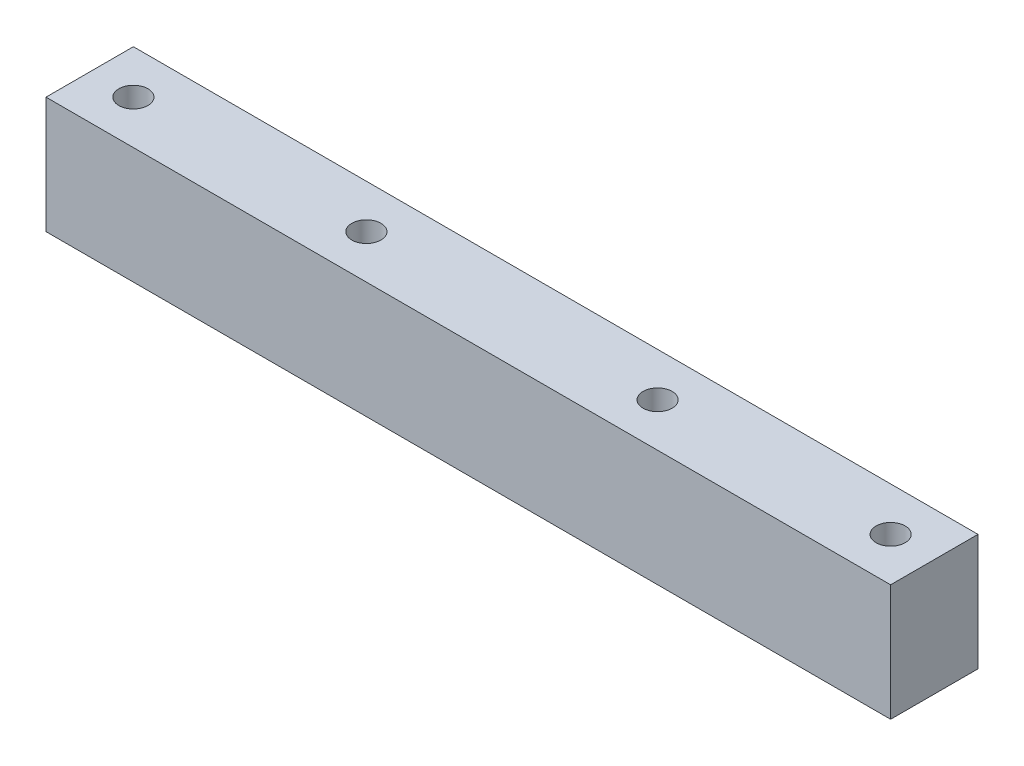
ISO-10303-21;
HEADER;
FILE_DESCRIPTION(('STEP AP214'),'2;1');
FILE_NAME('part.step','',(''),(''),'','','');
FILE_SCHEMA(('AUTOMOTIVE_DESIGN { 1 0 10303 214 1 1 1 1 }'));
ENDSEC;
DATA;
#1=APPLICATION_CONTEXT('core data for automotive mechanical design processes');
#2=APPLICATION_PROTOCOL_DEFINITION('international standard','automotive_design',2000,#1);
#3=PRODUCT_CONTEXT('',#1,'mechanical');
#4=PRODUCT('Part','Part','',(#3));
#5=PRODUCT_RELATED_PRODUCT_CATEGORY('part','',(#4));
#6=PRODUCT_DEFINITION_FORMATION('','',#4);
#7=PRODUCT_DEFINITION_CONTEXT('part definition',#1,'design');
#8=PRODUCT_DEFINITION('design','',#6,#7);
#9=PRODUCT_DEFINITION_SHAPE('','',#8);
#10=(LENGTH_UNIT() NAMED_UNIT(*) SI_UNIT(.MILLI.,.METRE.));
#11=(NAMED_UNIT(*) PLANE_ANGLE_UNIT() SI_UNIT($,.RADIAN.));
#12=(NAMED_UNIT(*) SI_UNIT($,.STERADIAN.) SOLID_ANGLE_UNIT());
#13=UNCERTAINTY_MEASURE_WITH_UNIT(LENGTH_MEASURE(1.E-05),#10,'distance_accuracy_value','');
#14=(GEOMETRIC_REPRESENTATION_CONTEXT(3) GLOBAL_UNCERTAINTY_ASSIGNED_CONTEXT((#13)) GLOBAL_UNIT_ASSIGNED_CONTEXT((#10,
#11,#12)) REPRESENTATION_CONTEXT('',''));
#15=CARTESIAN_POINT('',(0.,0.,0.));
#16=DIRECTION('',(0.,0.,1.));
#17=DIRECTION('',(1.,0.,0.));
#18=AXIS2_PLACEMENT_3D('',#15,#16,#17);
#19=CARTESIAN_POINT('',(0.,0.,15.));
#20=DIRECTION('',(1.,0.,0.));
#21=DIRECTION('',(0.,0.,-1.));
#22=AXIS2_PLACEMENT_3D('',#19,#20,#21);
#23=PLANE('',#22);
#24=DIRECTION('',(0.,-1.,0.));
#25=VECTOR('',#24,1.);
#26=CARTESIAN_POINT('',(0.,0.,0.));
#27=LINE('',#26,#25);
#28=CARTESIAN_POINT('',(0.,20.,0.));
#29=VERTEX_POINT('',#28);
#30=CARTESIAN_POINT('',(0.,0.,0.));
#31=VERTEX_POINT('',#30);
#32=EDGE_CURVE('E146',#29,#31,#27,.T.);
#33=ORIENTED_EDGE('',*,*,#32,.T.);
#34=DIRECTION('',(0.,0.,-1.));
#35=VECTOR('',#34,1.);
#36=CARTESIAN_POINT('',(0.,0.,15.));
#37=LINE('',#36,#35);
#38=CARTESIAN_POINT('',(0.,0.,15.));
#39=VERTEX_POINT('',#38);
#40=EDGE_CURVE('E11',#39,#31,#37,.T.);
#41=ORIENTED_EDGE('',*,*,#40,.F.);
#42=DIRECTION('',(0.,-1.,0.));
#43=VECTOR('',#42,1.);
#44=CARTESIAN_POINT('',(0.,0.,15.));
#45=LINE('',#44,#43);
#46=CARTESIAN_POINT('',(0.,20.,15.));
#47=VERTEX_POINT('',#46);
#48=EDGE_CURVE('E147',#47,#39,#45,.T.);
#49=ORIENTED_EDGE('',*,*,#48,.F.);
#50=DIRECTION('',(0.,0.,-1.));
#51=VECTOR('',#50,1.);
#52=CARTESIAN_POINT('',(0.,20.,15.));
#53=LINE('',#52,#51);
#54=EDGE_CURVE('E153',#47,#29,#53,.T.);
#55=ORIENTED_EDGE('',*,*,#54,.T.);
#56=EDGE_LOOP('',(#33,#41,#49,#55));
#57=FACE_BOUND('',#56,.T.);
#58=ADVANCED_FACE('F17',(#57),#23,.F.);
#59=CARTESIAN_POINT('',(0.,0.,15.));
#60=DIRECTION('',(0.,1.,0.));
#61=DIRECTION('',(0.,0.,1.));
#62=AXIS2_PLACEMENT_3D('',#59,#60,#61);
#63=PLANE('',#62);
#64=CARTESIAN_POINT('',(15.,0.,7.5));
#65=DIRECTION('',(0.,-1.,0.));
#66=DIRECTION('',(0.,0.,-1.));
#67=AXIS2_PLACEMENT_3D('',#64,#65,#66);
#68=CIRCLE('',#67,2.5);
#69=CARTESIAN_POINT('',(15.,0.,5.));
#70=VERTEX_POINT('',#69);
#71=EDGE_CURVE('E122',#70,#70,#68,.T.);
#72=ORIENTED_EDGE('',*,*,#71,.F.);
#73=EDGE_LOOP('',(#72));
#74=FACE_BOUND('',#73,.T.);
#75=CARTESIAN_POINT('',(55.,0.,7.5));
#76=DIRECTION('',(0.,-1.,0.));
#77=DIRECTION('',(0.,0.,-1.));
#78=AXIS2_PLACEMENT_3D('',#75,#76,#77);
#79=CIRCLE('',#78,2.5);
#80=CARTESIAN_POINT('',(55.,0.,5.));
#81=VERTEX_POINT('',#80);
#82=EDGE_CURVE('E128',#81,#81,#79,.T.);
#83=ORIENTED_EDGE('',*,*,#82,.F.);
#84=EDGE_LOOP('',(#83));
#85=FACE_BOUND('',#84,.T.);
#86=CARTESIAN_POINT('',(90.,0.,7.5));
#87=DIRECTION('',(0.,-1.,0.));
#88=DIRECTION('',(0.,0.,-1.));
#89=AXIS2_PLACEMENT_3D('',#86,#87,#88);
#90=CIRCLE('',#89,2.5);
#91=CARTESIAN_POINT('',(90.,0.,5.));
#92=VERTEX_POINT('',#91);
#93=EDGE_CURVE('E134',#92,#92,#90,.T.);
#94=ORIENTED_EDGE('',*,*,#93,.F.);
#95=EDGE_LOOP('',(#94));
#96=FACE_BOUND('',#95,.T.);
#97=CARTESIAN_POINT('',(130.,0.,7.5));
#98=DIRECTION('',(0.,-1.,0.));
#99=DIRECTION('',(0.,0.,-1.));
#100=AXIS2_PLACEMENT_3D('',#97,#98,#99);
#101=CIRCLE('',#100,2.5);
#102=CARTESIAN_POINT('',(130.,0.,5.));
#103=VERTEX_POINT('',#102);
#104=EDGE_CURVE('E140',#103,#103,#101,.T.);
#105=ORIENTED_EDGE('',*,*,#104,.F.);
#106=EDGE_LOOP('',(#105));
#107=FACE_BOUND('',#106,.T.);
#108=DIRECTION('',(1.,0.,0.));
#109=VECTOR('',#108,1.);
#110=CARTESIAN_POINT('',(0.,0.,0.));
#111=LINE('',#110,#109);
#112=CARTESIAN_POINT('',(145.,0.,0.));
#113=VERTEX_POINT('',#112);
#114=EDGE_CURVE('E156',#31,#113,#111,.T.);
#115=ORIENTED_EDGE('',*,*,#114,.T.);
#116=DIRECTION('',(0.,0.,-1.));
#117=VECTOR('',#116,1.);
#118=CARTESIAN_POINT('',(145.,0.,15.));
#119=LINE('',#118,#117);
#120=CARTESIAN_POINT('',(145.,0.,15.));
#121=VERTEX_POINT('',#120);
#122=EDGE_CURVE('E25',#121,#113,#119,.T.);
#123=ORIENTED_EDGE('',*,*,#122,.F.);
#124=DIRECTION('',(1.,0.,0.));
#125=VECTOR('',#124,1.);
#126=CARTESIAN_POINT('',(0.,0.,15.));
#127=LINE('',#126,#125);
#128=EDGE_CURVE('E64',#39,#121,#127,.T.);
#129=ORIENTED_EDGE('',*,*,#128,.F.);
#130=ORIENTED_EDGE('',*,*,#40,.T.);
#131=EDGE_LOOP('',(#115,#123,#129,#130));
#132=FACE_BOUND('',#131,.T.);
#133=ADVANCED_FACE('F181',(#74,#85,#96,#107,#132),#63,.F.);
#134=CARTESIAN_POINT('',(145.,0.,15.));
#135=DIRECTION('',(-1.,0.,0.));
#136=DIRECTION('',(0.,0.,1.));
#137=AXIS2_PLACEMENT_3D('',#134,#135,#136);
#138=PLANE('',#137);
#139=DIRECTION('',(0.,1.,0.));
#140=VECTOR('',#139,1.);
#141=CARTESIAN_POINT('',(145.,0.,0.));
#142=LINE('',#141,#140);
#143=CARTESIAN_POINT('',(145.,20.,0.));
#144=VERTEX_POINT('',#143);
#145=EDGE_CURVE('E51',#113,#144,#142,.T.);
#146=ORIENTED_EDGE('',*,*,#145,.T.);
#147=DIRECTION('',(0.,0.,-1.));
#148=VECTOR('',#147,1.);
#149=CARTESIAN_POINT('',(145.,20.,15.));
#150=LINE('',#149,#148);
#151=CARTESIAN_POINT('',(145.,20.,15.));
#152=VERTEX_POINT('',#151);
#153=EDGE_CURVE('E161',#152,#144,#150,.T.);
#154=ORIENTED_EDGE('',*,*,#153,.F.);
#155=DIRECTION('',(0.,1.,0.));
#156=VECTOR('',#155,1.);
#157=CARTESIAN_POINT('',(145.,0.,15.));
#158=LINE('',#157,#156);
#159=EDGE_CURVE('E150',#121,#152,#158,.T.);
#160=ORIENTED_EDGE('',*,*,#159,.F.);
#161=ORIENTED_EDGE('',*,*,#122,.T.);
#162=EDGE_LOOP('',(#146,#154,#160,#161));
#163=FACE_BOUND('',#162,.T.);
#164=ADVANCED_FACE('F163',(#163),#138,.F.);
#165=CARTESIAN_POINT('',(0.,20.,15.));
#166=DIRECTION('',(0.,-1.,0.));
#167=DIRECTION('',(0.,0.,-1.));
#168=AXIS2_PLACEMENT_3D('',#165,#166,#167);
#169=PLANE('',#168);
#170=CARTESIAN_POINT('',(137.5,20.,7.5));
#171=DIRECTION('',(0.,1.,0.));
#172=DIRECTION('',(0.,0.,1.));
#173=AXIS2_PLACEMENT_3D('',#170,#171,#172);
#174=CIRCLE('',#173,2.5);
#175=CARTESIAN_POINT('',(137.5,20.,10.));
#176=VERTEX_POINT('',#175);
#177=EDGE_CURVE('E100',#176,#176,#174,.T.);
#178=ORIENTED_EDGE('',*,*,#177,.F.);
#179=EDGE_LOOP('',(#178));
#180=FACE_BOUND('',#179,.T.);
#181=CARTESIAN_POINT('',(97.5,20.,7.5));
#182=DIRECTION('',(0.,1.,0.));
#183=DIRECTION('',(0.,0.,1.));
#184=AXIS2_PLACEMENT_3D('',#181,#182,#183);
#185=CIRCLE('',#184,2.5);
#186=CARTESIAN_POINT('',(97.5,20.,10.));
#187=VERTEX_POINT('',#186);
#188=EDGE_CURVE('E99',#187,#187,#185,.T.);
#189=ORIENTED_EDGE('',*,*,#188,.F.);
#190=EDGE_LOOP('',(#189));
#191=FACE_BOUND('',#190,.T.);
#192=CARTESIAN_POINT('',(47.5,20.,7.5));
#193=DIRECTION('',(0.,1.,0.));
#194=DIRECTION('',(0.,0.,1.));
#195=AXIS2_PLACEMENT_3D('',#192,#193,#194);
#196=CIRCLE('',#195,2.5);
#197=CARTESIAN_POINT('',(47.5,20.,10.));
#198=VERTEX_POINT('',#197);
#199=EDGE_CURVE('E110',#198,#198,#196,.T.);
#200=ORIENTED_EDGE('',*,*,#199,.F.);
#201=EDGE_LOOP('',(#200));
#202=FACE_BOUND('',#201,.T.);
#203=CARTESIAN_POINT('',(7.5,20.,7.5));
#204=DIRECTION('',(0.,1.,0.));
#205=DIRECTION('',(0.,0.,1.));
#206=AXIS2_PLACEMENT_3D('',#203,#204,#205);
#207=CIRCLE('',#206,2.5);
#208=CARTESIAN_POINT('',(7.5,20.,10.));
#209=VERTEX_POINT('',#208);
#210=EDGE_CURVE('E116',#209,#209,#207,.T.);
#211=ORIENTED_EDGE('',*,*,#210,.F.);
#212=EDGE_LOOP('',(#211));
#213=FACE_BOUND('',#212,.T.);
#214=DIRECTION('',(-1.,0.,0.));
#215=VECTOR('',#214,1.);
#216=CARTESIAN_POINT('',(0.,20.,0.));
#217=LINE('',#216,#215);
#218=EDGE_CURVE('E57',#144,#29,#217,.T.);
#219=ORIENTED_EDGE('',*,*,#218,.T.);
#220=ORIENTED_EDGE('',*,*,#54,.F.);
#221=DIRECTION('',(-1.,0.,0.));
#222=VECTOR('',#221,1.);
#223=CARTESIAN_POINT('',(0.,20.,15.));
#224=LINE('',#223,#222);
#225=EDGE_CURVE('E33',#152,#47,#224,.T.);
#226=ORIENTED_EDGE('',*,*,#225,.F.);
#227=ORIENTED_EDGE('',*,*,#153,.T.);
#228=EDGE_LOOP('',(#219,#220,#226,#227));
#229=FACE_BOUND('',#228,.T.);
#230=ADVANCED_FACE('F170',(#180,#191,#202,#213,#229),#169,.F.);
#231=CARTESIAN_POINT('',(0.,0.,15.));
#232=DIRECTION('',(0.,0.,-1.));
#233=DIRECTION('',(-1.,0.,0.));
#234=AXIS2_PLACEMENT_3D('',#231,#232,#233);
#235=PLANE('',#234);
#236=ORIENTED_EDGE('',*,*,#48,.T.);
#237=ORIENTED_EDGE('',*,*,#128,.T.);
#238=ORIENTED_EDGE('',*,*,#159,.T.);
#239=ORIENTED_EDGE('',*,*,#225,.T.);
#240=EDGE_LOOP('',(#236,#237,#238,#239));
#241=FACE_BOUND('',#240,.T.);
#242=ADVANCED_FACE('F172',(#241),#235,.F.);
#243=CARTESIAN_POINT('',(0.,0.,0.));
#244=DIRECTION('',(0.,0.,-1.));
#245=DIRECTION('',(-1.,0.,0.));
#246=AXIS2_PLACEMENT_3D('',#243,#244,#245);
#247=PLANE('',#246);
#248=ORIENTED_EDGE('',*,*,#32,.F.);
#249=ORIENTED_EDGE('',*,*,#218,.F.);
#250=ORIENTED_EDGE('',*,*,#145,.F.);
#251=ORIENTED_EDGE('',*,*,#114,.F.);
#252=EDGE_LOOP('',(#248,#249,#250,#251));
#253=FACE_BOUND('',#252,.T.);
#254=ADVANCED_FACE('F166',(#253),#247,.T.);
#255=CARTESIAN_POINT('',(130.,15.,7.5));
#256=DIRECTION('',(0.,-1.,0.));
#257=DIRECTION('',(0.,0.,-1.));
#258=AXIS2_PLACEMENT_3D('',#255,#256,#257);
#259=CONICAL_SURFACE('',#258,2.5,1.02974425867665);
#260=CARTESIAN_POINT('',(130.,16.5021515475689,7.5));
#261=VERTEX_POINT('',#260);
#262=VERTEX_LOOP('',#261);
#263=FACE_BOUND('',#262,.T.);
#264=CARTESIAN_POINT('',(130.,15.,7.5));
#265=DIRECTION('',(0.,-1.,0.));
#266=DIRECTION('',(0.,0.,-1.));
#267=AXIS2_PLACEMENT_3D('',#264,#265,#266);
#268=CIRCLE('',#267,2.5);
#269=CARTESIAN_POINT('',(130.,15.,5.));
#270=VERTEX_POINT('',#269);
#271=EDGE_CURVE('E143',#270,#270,#268,.T.);
#272=ORIENTED_EDGE('',*,*,#271,.T.);
#273=EDGE_LOOP('',(#272));
#274=FACE_BOUND('',#273,.T.);
#275=ADVANCED_FACE('F204',(#263,#274),#259,.F.);
#276=CARTESIAN_POINT('',(130.,0.,7.5));
#277=DIRECTION('',(0.,-1.,0.));
#278=DIRECTION('',(0.,0.,-1.));
#279=AXIS2_PLACEMENT_3D('',#276,#277,#278);
#280=CYLINDRICAL_SURFACE('',#279,2.5);
#281=ORIENTED_EDGE('',*,*,#271,.F.);
#282=EDGE_LOOP('',(#281));
#283=FACE_BOUND('',#282,.T.);
#284=ORIENTED_EDGE('',*,*,#104,.T.);
#285=EDGE_LOOP('',(#284));
#286=FACE_BOUND('',#285,.T.);
#287=ADVANCED_FACE('F201',(#283,#286),#280,.F.);
#288=CARTESIAN_POINT('',(90.,15.,7.5));
#289=DIRECTION('',(0.,-1.,0.));
#290=DIRECTION('',(0.,0.,-1.));
#291=AXIS2_PLACEMENT_3D('',#288,#289,#290);
#292=CONICAL_SURFACE('',#291,2.5,1.02974425867665);
#293=CARTESIAN_POINT('',(90.,16.5021515475689,7.5));
#294=VERTEX_POINT('',#293);
#295=VERTEX_LOOP('',#294);
#296=FACE_BOUND('',#295,.T.);
#297=CARTESIAN_POINT('',(90.,15.,7.5));
#298=DIRECTION('',(0.,-1.,0.));
#299=DIRECTION('',(0.,0.,-1.));
#300=AXIS2_PLACEMENT_3D('',#297,#298,#299);
#301=CIRCLE('',#300,2.5);
#302=CARTESIAN_POINT('',(90.,15.,5.));
#303=VERTEX_POINT('',#302);
#304=EDGE_CURVE('E137',#303,#303,#301,.T.);
#305=ORIENTED_EDGE('',*,*,#304,.T.);
#306=EDGE_LOOP('',(#305));
#307=FACE_BOUND('',#306,.T.);
#308=ADVANCED_FACE('F203',(#296,#307),#292,.F.);
#309=CARTESIAN_POINT('',(90.,0.,7.5));
#310=DIRECTION('',(0.,-1.,0.));
#311=DIRECTION('',(0.,0.,-1.));
#312=AXIS2_PLACEMENT_3D('',#309,#310,#311);
#313=CYLINDRICAL_SURFACE('',#312,2.5);
#314=ORIENTED_EDGE('',*,*,#304,.F.);
#315=EDGE_LOOP('',(#314));
#316=FACE_BOUND('',#315,.T.);
#317=ORIENTED_EDGE('',*,*,#93,.T.);
#318=EDGE_LOOP('',(#317));
#319=FACE_BOUND('',#318,.T.);
#320=ADVANCED_FACE('F211',(#316,#319),#313,.F.);
#321=CARTESIAN_POINT('',(55.,15.,7.5));
#322=DIRECTION('',(0.,-1.,0.));
#323=DIRECTION('',(0.,0.,-1.));
#324=AXIS2_PLACEMENT_3D('',#321,#322,#323);
#325=CONICAL_SURFACE('',#324,2.5,1.02974425867665);
#326=CARTESIAN_POINT('',(55.,16.5021515475689,7.5));
#327=VERTEX_POINT('',#326);
#328=VERTEX_LOOP('',#327);
#329=FACE_BOUND('',#328,.T.);
#330=CARTESIAN_POINT('',(55.,15.,7.5));
#331=DIRECTION('',(0.,-1.,0.));
#332=DIRECTION('',(0.,0.,-1.));
#333=AXIS2_PLACEMENT_3D('',#330,#331,#332);
#334=CIRCLE('',#333,2.5);
#335=CARTESIAN_POINT('',(55.,15.,5.));
#336=VERTEX_POINT('',#335);
#337=EDGE_CURVE('E131',#336,#336,#334,.T.);
#338=ORIENTED_EDGE('',*,*,#337,.T.);
#339=EDGE_LOOP('',(#338));
#340=FACE_BOUND('',#339,.T.);
#341=ADVANCED_FACE('F254',(#329,#340),#325,.F.);
#342=CARTESIAN_POINT('',(55.,0.,7.5));
#343=DIRECTION('',(0.,-1.,0.));
#344=DIRECTION('',(0.,0.,-1.));
#345=AXIS2_PLACEMENT_3D('',#342,#343,#344);
#346=CYLINDRICAL_SURFACE('',#345,2.5);
#347=ORIENTED_EDGE('',*,*,#337,.F.);
#348=EDGE_LOOP('',(#347));
#349=FACE_BOUND('',#348,.T.);
#350=ORIENTED_EDGE('',*,*,#82,.T.);
#351=EDGE_LOOP('',(#350));
#352=FACE_BOUND('',#351,.T.);
#353=ADVANCED_FACE('F263',(#349,#352),#346,.F.);
#354=CARTESIAN_POINT('',(15.,15.,7.5));
#355=DIRECTION('',(0.,-1.,0.));
#356=DIRECTION('',(0.,0.,-1.));
#357=AXIS2_PLACEMENT_3D('',#354,#355,#356);
#358=CONICAL_SURFACE('',#357,2.5,1.02974425867665);
#359=CARTESIAN_POINT('',(15.,16.5021515475689,7.5));
#360=VERTEX_POINT('',#359);
#361=VERTEX_LOOP('',#360);
#362=FACE_BOUND('',#361,.T.);
#363=CARTESIAN_POINT('',(15.,15.,7.5));
#364=DIRECTION('',(0.,-1.,0.));
#365=DIRECTION('',(0.,0.,-1.));
#366=AXIS2_PLACEMENT_3D('',#363,#364,#365);
#367=CIRCLE('',#366,2.5);
#368=CARTESIAN_POINT('',(15.,15.,5.));
#369=VERTEX_POINT('',#368);
#370=EDGE_CURVE('E125',#369,#369,#367,.T.);
#371=ORIENTED_EDGE('',*,*,#370,.T.);
#372=EDGE_LOOP('',(#371));
#373=FACE_BOUND('',#372,.T.);
#374=ADVANCED_FACE('F273',(#362,#373),#358,.F.);
#375=CARTESIAN_POINT('',(15.,0.,7.5));
#376=DIRECTION('',(0.,-1.,0.));
#377=DIRECTION('',(0.,0.,-1.));
#378=AXIS2_PLACEMENT_3D('',#375,#376,#377);
#379=CYLINDRICAL_SURFACE('',#378,2.5);
#380=ORIENTED_EDGE('',*,*,#370,.F.);
#381=EDGE_LOOP('',(#380));
#382=FACE_BOUND('',#381,.T.);
#383=ORIENTED_EDGE('',*,*,#71,.T.);
#384=EDGE_LOOP('',(#383));
#385=FACE_BOUND('',#384,.T.);
#386=ADVANCED_FACE('F283',(#382,#385),#379,.F.);
#387=CARTESIAN_POINT('',(7.5,5.,7.5));
#388=DIRECTION('',(0.,1.,0.));
#389=DIRECTION('',(0.,0.,1.));
#390=AXIS2_PLACEMENT_3D('',#387,#388,#389);
#391=CONICAL_SURFACE('',#390,2.5,1.02974425867665);
#392=CARTESIAN_POINT('',(7.5,3.4978484524311,7.5));
#393=VERTEX_POINT('',#392);
#394=VERTEX_LOOP('',#393);
#395=FACE_BOUND('',#394,.T.);
#396=CARTESIAN_POINT('',(7.5,5.,7.5));
#397=DIRECTION('',(0.,1.,0.));
#398=DIRECTION('',(0.,0.,1.));
#399=AXIS2_PLACEMENT_3D('',#396,#397,#398);
#400=CIRCLE('',#399,2.5);
#401=CARTESIAN_POINT('',(7.5,5.,10.));
#402=VERTEX_POINT('',#401);
#403=EDGE_CURVE('E119',#402,#402,#400,.T.);
#404=ORIENTED_EDGE('',*,*,#403,.T.);
#405=EDGE_LOOP('',(#404));
#406=FACE_BOUND('',#405,.T.);
#407=ADVANCED_FACE('F293',(#395,#406),#391,.F.);
#408=CARTESIAN_POINT('',(7.5,20.,7.5));
#409=DIRECTION('',(0.,1.,0.));
#410=DIRECTION('',(0.,0.,1.));
#411=AXIS2_PLACEMENT_3D('',#408,#409,#410);
#412=CYLINDRICAL_SURFACE('',#411,2.5);
#413=ORIENTED_EDGE('',*,*,#403,.F.);
#414=EDGE_LOOP('',(#413));
#415=FACE_BOUND('',#414,.T.);
#416=ORIENTED_EDGE('',*,*,#210,.T.);
#417=EDGE_LOOP('',(#416));
#418=FACE_BOUND('',#417,.T.);
#419=ADVANCED_FACE('F303',(#415,#418),#412,.F.);
#420=CARTESIAN_POINT('',(47.5,5.,7.5));
#421=DIRECTION('',(0.,1.,0.));
#422=DIRECTION('',(0.,0.,1.));
#423=AXIS2_PLACEMENT_3D('',#420,#421,#422);
#424=CONICAL_SURFACE('',#423,2.5,1.02974425867665);
#425=CARTESIAN_POINT('',(47.5,3.4978484524311,7.5));
#426=VERTEX_POINT('',#425);
#427=VERTEX_LOOP('',#426);
#428=FACE_BOUND('',#427,.T.);
#429=CARTESIAN_POINT('',(47.5,5.,7.5));
#430=DIRECTION('',(0.,1.,0.));
#431=DIRECTION('',(0.,0.,1.));
#432=AXIS2_PLACEMENT_3D('',#429,#430,#431);
#433=CIRCLE('',#432,2.5);
#434=CARTESIAN_POINT('',(47.5,5.,10.));
#435=VERTEX_POINT('',#434);
#436=EDGE_CURVE('E113',#435,#435,#433,.T.);
#437=ORIENTED_EDGE('',*,*,#436,.T.);
#438=EDGE_LOOP('',(#437));
#439=FACE_BOUND('',#438,.T.);
#440=ADVANCED_FACE('F313',(#428,#439),#424,.F.);
#441=CARTESIAN_POINT('',(47.5,20.,7.5));
#442=DIRECTION('',(0.,1.,0.));
#443=DIRECTION('',(0.,0.,1.));
#444=AXIS2_PLACEMENT_3D('',#441,#442,#443);
#445=CYLINDRICAL_SURFACE('',#444,2.5);
#446=ORIENTED_EDGE('',*,*,#436,.F.);
#447=EDGE_LOOP('',(#446));
#448=FACE_BOUND('',#447,.T.);
#449=ORIENTED_EDGE('',*,*,#199,.T.);
#450=EDGE_LOOP('',(#449));
#451=FACE_BOUND('',#450,.T.);
#452=ADVANCED_FACE('F324',(#448,#451),#445,.F.);
#453=CARTESIAN_POINT('',(97.5,5.,7.5));
#454=DIRECTION('',(0.,1.,0.));
#455=DIRECTION('',(0.,0.,1.));
#456=AXIS2_PLACEMENT_3D('',#453,#454,#455);
#457=CONICAL_SURFACE('',#456,2.5,1.02974425867665);
#458=CARTESIAN_POINT('',(97.5,3.4978484524311,7.5));
#459=VERTEX_POINT('',#458);
#460=VERTEX_LOOP('',#459);
#461=FACE_BOUND('',#460,.T.);
#462=CARTESIAN_POINT('',(97.5,5.,7.5));
#463=DIRECTION('',(0.,1.,0.));
#464=DIRECTION('',(0.,0.,1.));
#465=AXIS2_PLACEMENT_3D('',#462,#463,#464);
#466=CIRCLE('',#465,2.5);
#467=CARTESIAN_POINT('',(97.5,5.,10.));
#468=VERTEX_POINT('',#467);
#469=EDGE_CURVE('E103',#468,#468,#466,.T.);
#470=ORIENTED_EDGE('',*,*,#469,.T.);
#471=EDGE_LOOP('',(#470));
#472=FACE_BOUND('',#471,.T.);
#473=ADVANCED_FACE('F334',(#461,#472),#457,.F.);
#474=CARTESIAN_POINT('',(97.5,20.,7.5));
#475=DIRECTION('',(0.,1.,0.));
#476=DIRECTION('',(0.,0.,1.));
#477=AXIS2_PLACEMENT_3D('',#474,#475,#476);
#478=CYLINDRICAL_SURFACE('',#477,2.5);
#479=ORIENTED_EDGE('',*,*,#469,.F.);
#480=EDGE_LOOP('',(#479));
#481=FACE_BOUND('',#480,.T.);
#482=ORIENTED_EDGE('',*,*,#188,.T.);
#483=EDGE_LOOP('',(#482));
#484=FACE_BOUND('',#483,.T.);
#485=ADVANCED_FACE('F93',(#481,#484),#478,.F.);
#486=CARTESIAN_POINT('',(137.5,5.,7.5));
#487=DIRECTION('',(0.,1.,0.));
#488=DIRECTION('',(0.,0.,1.));
#489=AXIS2_PLACEMENT_3D('',#486,#487,#488);
#490=CONICAL_SURFACE('',#489,2.5,1.02974425867665);
#491=CARTESIAN_POINT('',(137.5,3.4978484524311,7.5));
#492=VERTEX_POINT('',#491);
#493=VERTEX_LOOP('',#492);
#494=FACE_BOUND('',#493,.T.);
#495=CARTESIAN_POINT('',(137.5,5.,7.5));
#496=DIRECTION('',(0.,1.,0.));
#497=DIRECTION('',(0.,0.,1.));
#498=AXIS2_PLACEMENT_3D('',#495,#496,#497);
#499=CIRCLE('',#498,2.5);
#500=CARTESIAN_POINT('',(137.5,5.,10.));
#501=VERTEX_POINT('',#500);
#502=EDGE_CURVE('E97',#501,#501,#499,.T.);
#503=ORIENTED_EDGE('',*,*,#502,.T.);
#504=EDGE_LOOP('',(#503));
#505=FACE_BOUND('',#504,.T.);
#506=ADVANCED_FACE('F89',(#494,#505),#490,.F.);
#507=CARTESIAN_POINT('',(137.5,20.,7.5));
#508=DIRECTION('',(0.,1.,0.));
#509=DIRECTION('',(0.,0.,1.));
#510=AXIS2_PLACEMENT_3D('',#507,#508,#509);
#511=CYLINDRICAL_SURFACE('',#510,2.5);
#512=ORIENTED_EDGE('',*,*,#502,.F.);
#513=EDGE_LOOP('',(#512));
#514=FACE_BOUND('',#513,.T.);
#515=ORIENTED_EDGE('',*,*,#177,.T.);
#516=EDGE_LOOP('',(#515));
#517=FACE_BOUND('',#516,.T.);
#518=ADVANCED_FACE('F92',(#514,#517),#511,.F.);
#519=CLOSED_SHELL('',(#58,#133,#164,#230,#242,#254,#275,#287,#308,#320,#341,#353,#374,#386,#407,
#419,#440,#452,#473,#485,#506,#518));
#520=MANIFOLD_SOLID_BREP('B1',#519);
#521=ADVANCED_BREP_SHAPE_REPRESENTATION('',(#18,#520),#14);
#522=SHAPE_DEFINITION_REPRESENTATION(#9,#521);
ENDSEC;
END-ISO-10303-21;
